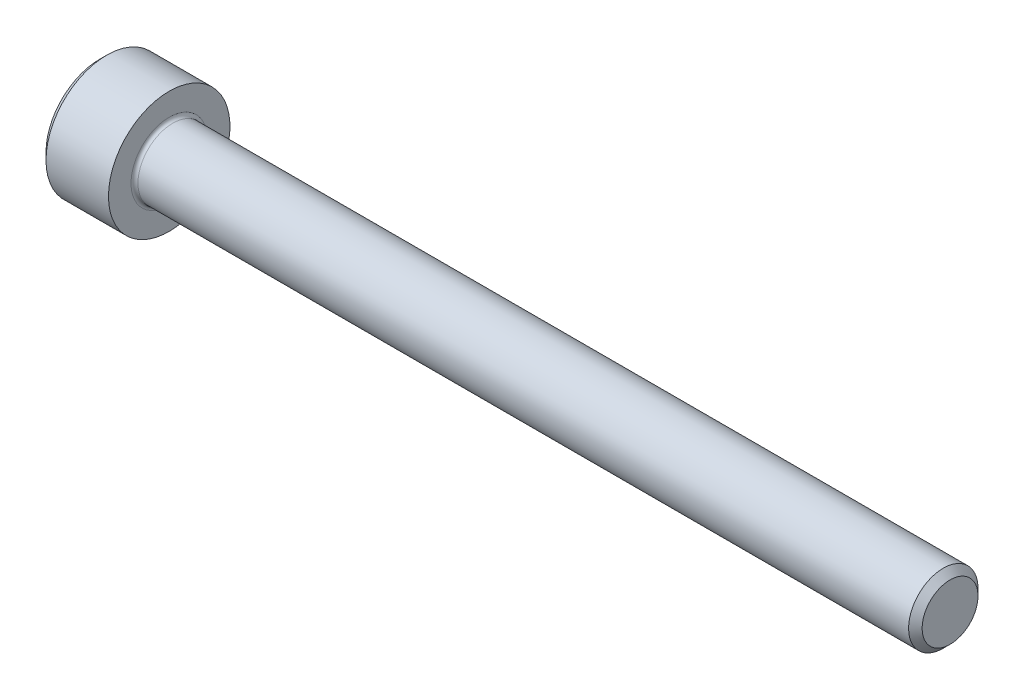
ISO-10303-21;
HEADER;
FILE_DESCRIPTION(('STEP AP214'),'2;1');
FILE_NAME('part.step','',(''),(''),'','','');
FILE_SCHEMA(('AUTOMOTIVE_DESIGN { 1 0 10303 214 1 1 1 1 }'));
ENDSEC;
DATA;
#1=APPLICATION_CONTEXT('core data for automotive mechanical design processes');
#2=APPLICATION_PROTOCOL_DEFINITION('international standard','automotive_design',2000,#1);
#3=PRODUCT_CONTEXT('',#1,'mechanical');
#4=PRODUCT('Part','Part','',(#3));
#5=PRODUCT_RELATED_PRODUCT_CATEGORY('part','',(#4));
#6=PRODUCT_DEFINITION_FORMATION('','',#4);
#7=PRODUCT_DEFINITION_CONTEXT('part definition',#1,'design');
#8=PRODUCT_DEFINITION('design','',#6,#7);
#9=PRODUCT_DEFINITION_SHAPE('','',#8);
#10=(LENGTH_UNIT() NAMED_UNIT(*) SI_UNIT(.MILLI.,.METRE.));
#11=(NAMED_UNIT(*) PLANE_ANGLE_UNIT() SI_UNIT($,.RADIAN.));
#12=(NAMED_UNIT(*) SI_UNIT($,.STERADIAN.) SOLID_ANGLE_UNIT());
#13=UNCERTAINTY_MEASURE_WITH_UNIT(LENGTH_MEASURE(1.E-05),#10,'distance_accuracy_value','');
#14=(GEOMETRIC_REPRESENTATION_CONTEXT(3) GLOBAL_UNCERTAINTY_ASSIGNED_CONTEXT((#13)) GLOBAL_UNIT_ASSIGNED_CONTEXT((#10,
#11,#12)) REPRESENTATION_CONTEXT('',''));
#15=CARTESIAN_POINT('',(0.,0.,0.));
#16=DIRECTION('',(0.,0.,1.));
#17=DIRECTION('',(1.,0.,0.));
#18=AXIS2_PLACEMENT_3D('',#15,#16,#17);
#19=CARTESIAN_POINT('',(0.,0.,0.));
#20=DIRECTION('',(-1.,0.,0.));
#21=DIRECTION('',(0.,0.,1.));
#22=AXIS2_PLACEMENT_3D('',#19,#20,#21);
#23=PLANE('',#22);
#24=DIRECTION('',(0.,-0.499999999999999,0.866025403784439));
#25=VECTOR('',#24,1.);
#26=CARTESIAN_POINT('',(0.,1.77304267668134,0.));
#27=LINE('',#26,#25);
#28=CARTESIAN_POINT('',(0.,1.77304267668134,0.));
#29=VERTEX_POINT('',#28);
#30=CARTESIAN_POINT('',(0.,0.886521338340669,1.5355));
#31=VERTEX_POINT('',#30);
#32=EDGE_CURVE('E388',#29,#31,#27,.T.);
#33=ORIENTED_EDGE('',*,*,#32,.T.);
#34=DIRECTION('',(0.,1.,0.));
#35=VECTOR('',#34,1.);
#36=CARTESIAN_POINT('',(0.,-0.886521338340671,1.5355));
#37=LINE('',#36,#35);
#38=CARTESIAN_POINT('',(0.,-0.886521338340671,1.5355));
#39=VERTEX_POINT('',#38);
#40=EDGE_CURVE('E132',#39,#31,#37,.T.);
#41=ORIENTED_EDGE('',*,*,#40,.F.);
#42=DIRECTION('',(0.,-0.500000000000001,-0.866025403784438));
#43=VECTOR('',#42,1.);
#44=CARTESIAN_POINT('',(0.,-0.886521338340671,1.5355));
#45=LINE('',#44,#43);
#46=CARTESIAN_POINT('',(0.,-1.77304267668134,0.));
#47=VERTEX_POINT('',#46);
#48=EDGE_CURVE('E391',#39,#47,#45,.T.);
#49=ORIENTED_EDGE('',*,*,#48,.T.);
#50=DIRECTION('',(0.,0.499999999999999,-0.866025403784439));
#51=VECTOR('',#50,1.);
#52=CARTESIAN_POINT('',(0.,-1.77304267668134,0.));
#53=LINE('',#52,#51);
#54=CARTESIAN_POINT('',(0.,-0.886521338340676,-1.5355));
#55=VERTEX_POINT('',#54);
#56=EDGE_CURVE('E394',#47,#55,#53,.T.);
#57=ORIENTED_EDGE('',*,*,#56,.T.);
#58=DIRECTION('',(0.,-1.,0.));
#59=VECTOR('',#58,1.);
#60=CARTESIAN_POINT('',(0.,0.886521338340665,-1.5355));
#61=LINE('',#60,#59);
#62=CARTESIAN_POINT('',(0.,0.886521338340665,-1.5355));
#63=VERTEX_POINT('',#62);
#64=EDGE_CURVE('E397',#63,#55,#61,.T.);
#65=ORIENTED_EDGE('',*,*,#64,.F.);
#66=DIRECTION('',(0.,-0.500000000000001,-0.866025403784438));
#67=VECTOR('',#66,1.);
#68=CARTESIAN_POINT('',(0.,1.77304267668134,0.));
#69=LINE('',#68,#67);
#70=EDGE_CURVE('E127',#29,#63,#69,.T.);
#71=ORIENTED_EDGE('',*,*,#70,.F.);
#72=EDGE_LOOP('',(#33,#41,#49,#57,#65,#71));
#73=FACE_BOUND('',#72,.T.);
#74=CARTESIAN_POINT('',(0.,0.,0.));
#75=DIRECTION('',(-1.,0.,0.));
#76=DIRECTION('',(0.,0.,1.));
#77=AXIS2_PLACEMENT_3D('',#74,#75,#76);
#78=CIRCLE('',#77,3.1);
#79=CARTESIAN_POINT('',(0.,0.,3.1));
#80=VERTEX_POINT('',#79);
#81=EDGE_CURVE('E143',#80,#80,#78,.T.);
#82=ORIENTED_EDGE('',*,*,#81,.T.);
#83=EDGE_LOOP('',(#82));
#84=FACE_BOUND('',#83,.T.);
#85=ADVANCED_FACE('F36',(#73,#84),#23,.T.);
#86=CARTESIAN_POINT('',(49.,1.61,0.));
#87=DIRECTION('',(1.,0.,0.));
#88=DIRECTION('',(0.,0.,-1.));
#89=AXIS2_PLACEMENT_3D('',#86,#87,#88);
#90=PLANE('',#89);
#91=CARTESIAN_POINT('',(49.,0.,0.));
#92=DIRECTION('',(-1.,0.,0.));
#93=DIRECTION('',(0.,0.,1.));
#94=AXIS2_PLACEMENT_3D('',#91,#92,#93);
#95=CIRCLE('',#94,1.61);
#96=CARTESIAN_POINT('',(49.,0.,1.61));
#97=VERTEX_POINT('',#96);
#98=EDGE_CURVE('E156',#97,#97,#95,.T.);
#99=ORIENTED_EDGE('',*,*,#98,.F.);
#100=EDGE_LOOP('',(#99));
#101=FACE_BOUND('',#100,.T.);
#102=ADVANCED_FACE('F177',(#101),#90,.T.);
#103=CARTESIAN_POINT('',(49.,0.,0.));
#104=DIRECTION('',(-1.,0.,0.));
#105=DIRECTION('',(0.,0.,1.));
#106=AXIS2_PLACEMENT_3D('',#103,#104,#105);
#107=CONICAL_SURFACE('',#106,1.61,0.785398163397374);
#108=CARTESIAN_POINT('',(48.61,0.,0.));
#109=DIRECTION('',(-1.,0.,0.));
#110=DIRECTION('',(0.,0.,1.));
#111=AXIS2_PLACEMENT_3D('',#108,#109,#110);
#112=CIRCLE('',#111,1.99999999999997);
#113=CARTESIAN_POINT('',(48.61,0.,1.99999999999997));
#114=VERTEX_POINT('',#113);
#115=EDGE_CURVE('E153',#114,#114,#112,.T.);
#116=ORIENTED_EDGE('',*,*,#115,.F.);
#117=EDGE_LOOP('',(#116));
#118=FACE_BOUND('',#117,.T.);
#119=ORIENTED_EDGE('',*,*,#98,.T.);
#120=EDGE_LOOP('',(#119));
#121=FACE_BOUND('',#120,.T.);
#122=ADVANCED_FACE('F183',(#118,#121),#107,.T.);
#123=CARTESIAN_POINT('',(-31.75,0.,0.));
#124=DIRECTION('',(-1.,0.,0.));
#125=DIRECTION('',(0.,0.,1.));
#126=AXIS2_PLACEMENT_3D('',#123,#124,#125);
#127=CYLINDRICAL_SURFACE('',#126,1.99999999999999);
#128=CARTESIAN_POINT('',(4.2,0.,0.));
#129=DIRECTION('',(1.,0.,0.));
#130=DIRECTION('',(0.,0.,-1.));
#131=AXIS2_PLACEMENT_3D('',#128,#129,#130);
#132=CIRCLE('',#131,1.99999999999999);
#133=CARTESIAN_POINT('',(4.2,0.,-1.99999999999999));
#134=VERTEX_POINT('',#133);
#135=EDGE_CURVE('E11',#134,#134,#132,.T.);
#136=ORIENTED_EDGE('',*,*,#135,.T.);
#137=EDGE_LOOP('',(#136));
#138=FACE_BOUND('',#137,.T.);
#139=ORIENTED_EDGE('',*,*,#115,.T.);
#140=EDGE_LOOP('',(#139));
#141=FACE_BOUND('',#140,.T.);
#142=ADVANCED_FACE('F194',(#138,#141),#127,.T.);
#143=CARTESIAN_POINT('',(4.,3.5,0.));
#144=DIRECTION('',(1.,0.,0.));
#145=DIRECTION('',(0.,0.,-1.));
#146=AXIS2_PLACEMENT_3D('',#143,#144,#145);
#147=PLANE('',#146);
#148=CARTESIAN_POINT('',(4.,0.,0.));
#149=DIRECTION('',(1.,0.,0.));
#150=DIRECTION('',(0.,0.,-1.));
#151=AXIS2_PLACEMENT_3D('',#148,#149,#150);
#152=CIRCLE('',#151,2.19999999999999);
#153=CARTESIAN_POINT('',(4.,0.,-2.19999999999999));
#154=VERTEX_POINT('',#153);
#155=EDGE_CURVE('E44',#154,#154,#152,.F.);
#156=ORIENTED_EDGE('',*,*,#155,.T.);
#157=EDGE_LOOP('',(#156));
#158=FACE_BOUND('',#157,.T.);
#159=CARTESIAN_POINT('',(4.,0.,0.));
#160=DIRECTION('',(-1.,0.,0.));
#161=DIRECTION('',(0.,0.,1.));
#162=AXIS2_PLACEMENT_3D('',#159,#160,#161);
#163=CIRCLE('',#162,3.5);
#164=CARTESIAN_POINT('',(4.,0.,3.5));
#165=VERTEX_POINT('',#164);
#166=EDGE_CURVE('E150',#165,#165,#163,.T.);
#167=ORIENTED_EDGE('',*,*,#166,.F.);
#168=EDGE_LOOP('',(#167));
#169=FACE_BOUND('',#168,.T.);
#170=ADVANCED_FACE('F161',(#158,#169),#147,.T.);
#171=CARTESIAN_POINT('',(-31.75,0.,0.));
#172=DIRECTION('',(-1.,0.,0.));
#173=DIRECTION('',(0.,0.,1.));
#174=AXIS2_PLACEMENT_3D('',#171,#172,#173);
#175=CYLINDRICAL_SURFACE('',#174,3.5);
#176=ORIENTED_EDGE('',*,*,#166,.T.);
#177=EDGE_LOOP('',(#176));
#178=FACE_BOUND('',#177,.T.);
#179=CARTESIAN_POINT('',(0.399999999999998,0.,0.));
#180=DIRECTION('',(-1.,0.,0.));
#181=DIRECTION('',(0.,0.,1.));
#182=AXIS2_PLACEMENT_3D('',#179,#180,#181);
#183=CIRCLE('',#182,3.5);
#184=CARTESIAN_POINT('',(0.399999999999998,0.,3.5));
#185=VERTEX_POINT('',#184);
#186=EDGE_CURVE('E147',#185,#185,#183,.T.);
#187=ORIENTED_EDGE('',*,*,#186,.F.);
#188=EDGE_LOOP('',(#187));
#189=FACE_BOUND('',#188,.T.);
#190=ADVANCED_FACE('F172',(#178,#189),#175,.T.);
#191=CARTESIAN_POINT('',(0.,0.,0.));
#192=DIRECTION('',(1.,0.,0.));
#193=DIRECTION('',(0.,0.,-1.));
#194=AXIS2_PLACEMENT_3D('',#191,#192,#193);
#195=CONICAL_SURFACE('',#194,3.1,0.785398163397447);
#196=ORIENTED_EDGE('',*,*,#186,.T.);
#197=EDGE_LOOP('',(#196));
#198=FACE_BOUND('',#197,.T.);
#199=ORIENTED_EDGE('',*,*,#81,.F.);
#200=EDGE_LOOP('',(#199));
#201=FACE_BOUND('',#200,.T.);
#202=ADVANCED_FACE('F165',(#198,#201),#195,.T.);
#203=CARTESIAN_POINT('',(4.2,0.,0.));
#204=DIRECTION('',(1.,0.,0.));
#205=DIRECTION('',(0.,0.,-1.));
#206=AXIS2_PLACEMENT_3D('',#203,#204,#205);
#207=TOROIDAL_SURFACE('',#206,2.19999999999999,0.2);
#208=ORIENTED_EDGE('',*,*,#135,.F.);
#209=EDGE_LOOP('',(#208));
#210=FACE_BOUND('',#209,.T.);
#211=ORIENTED_EDGE('',*,*,#155,.F.);
#212=EDGE_LOOP('',(#211));
#213=FACE_BOUND('',#212,.T.);
#214=ADVANCED_FACE('F38',(#210,#213),#207,.F.);
#215=CARTESIAN_POINT('',(2.,1.77304267668134,0.));
#216=DIRECTION('',(0.,-0.866025403784439,-0.499999999999999));
#217=DIRECTION('',(0.,0.499999999999999,-0.866025403784439));
#218=AXIS2_PLACEMENT_3D('',#215,#216,#217);
#219=PLANE('',#218);
#220=ORIENTED_EDGE('',*,*,#32,.F.);
#221=DIRECTION('',(-1.,0.,0.));
#222=VECTOR('',#221,1.);
#223=CARTESIAN_POINT('',(2.,1.77304267668134,0.));
#224=LINE('',#223,#222);
#225=CARTESIAN_POINT('',(2.,1.77304267668134,0.));
#226=VERTEX_POINT('',#225);
#227=EDGE_CURVE('E378',#226,#29,#224,.T.);
#228=ORIENTED_EDGE('',*,*,#227,.F.);
#229=DIRECTION('',(0.,-0.499999999999999,0.866025403784439));
#230=VECTOR('',#229,1.);
#231=CARTESIAN_POINT('',(2.,1.77304267668134,0.));
#232=LINE('',#231,#230);
#233=CARTESIAN_POINT('',(2.,1.329782007511,0.767749999999997));
#234=VERTEX_POINT('',#233);
#235=EDGE_CURVE('E119',#226,#234,#232,.T.);
#236=ORIENTED_EDGE('',*,*,#235,.T.);
#237=CARTESIAN_POINT('',(2.,0.886521338340669,1.5355));
#238=VERTEX_POINT('',#237);
#239=EDGE_CURVE('E110',#234,#238,#232,.T.);
#240=ORIENTED_EDGE('',*,*,#239,.T.);
#241=DIRECTION('',(-1.,0.,0.));
#242=VECTOR('',#241,1.);
#243=CARTESIAN_POINT('',(2.,0.886521338340669,1.5355));
#244=LINE('',#243,#242);
#245=EDGE_CURVE('E124',#238,#31,#244,.T.);
#246=ORIENTED_EDGE('',*,*,#245,.T.);
#247=EDGE_LOOP('',(#220,#228,#236,#240,#246));
#248=FACE_BOUND('',#247,.T.);
#249=ADVANCED_FACE('F123',(#248),#219,.T.);
#250=CARTESIAN_POINT('',(2.,-0.886521338340671,1.5355));
#251=DIRECTION('',(0.,0.,1.));
#252=DIRECTION('',(0.,-1.,0.));
#253=AXIS2_PLACEMENT_3D('',#250,#251,#252);
#254=PLANE('',#253);
#255=ORIENTED_EDGE('',*,*,#40,.T.);
#256=ORIENTED_EDGE('',*,*,#245,.F.);
#257=DIRECTION('',(0.,1.,0.));
#258=VECTOR('',#257,1.);
#259=CARTESIAN_POINT('',(2.,-0.886521338340671,1.5355));
#260=LINE('',#259,#258);
#261=CARTESIAN_POINT('',(2.,0.,1.5355));
#262=VERTEX_POINT('',#261);
#263=EDGE_CURVE('E107',#262,#238,#260,.T.);
#264=ORIENTED_EDGE('',*,*,#263,.F.);
#265=CARTESIAN_POINT('',(2.,-0.886521338340671,1.5355));
#266=VERTEX_POINT('',#265);
#267=EDGE_CURVE('E118',#266,#262,#260,.T.);
#268=ORIENTED_EDGE('',*,*,#267,.F.);
#269=DIRECTION('',(-1.,0.,0.));
#270=VECTOR('',#269,1.);
#271=CARTESIAN_POINT('',(2.,-0.886521338340671,1.5355));
#272=LINE('',#271,#270);
#273=EDGE_CURVE('E134',#266,#39,#272,.T.);
#274=ORIENTED_EDGE('',*,*,#273,.T.);
#275=EDGE_LOOP('',(#255,#256,#264,#268,#274));
#276=FACE_BOUND('',#275,.T.);
#277=ADVANCED_FACE('F129',(#276),#254,.F.);
#278=CARTESIAN_POINT('',(2.,-0.886521338340671,1.5355));
#279=DIRECTION('',(0.,0.866025403784438,-0.500000000000001));
#280=DIRECTION('',(0.,0.500000000000001,0.866025403784438));
#281=AXIS2_PLACEMENT_3D('',#278,#279,#280);
#282=PLANE('',#281);
#283=ORIENTED_EDGE('',*,*,#48,.F.);
#284=ORIENTED_EDGE('',*,*,#273,.F.);
#285=DIRECTION('',(0.,-0.500000000000001,-0.866025403784438));
#286=VECTOR('',#285,1.);
#287=CARTESIAN_POINT('',(2.,-0.886521338340671,1.5355));
#288=LINE('',#287,#286);
#289=CARTESIAN_POINT('',(2.,-1.32978200751101,0.767750000000002));
#290=VERTEX_POINT('',#289);
#291=EDGE_CURVE('E417',#266,#290,#288,.T.);
#292=ORIENTED_EDGE('',*,*,#291,.T.);
#293=CARTESIAN_POINT('',(2.,-1.77304267668134,0.));
#294=VERTEX_POINT('',#293);
#295=EDGE_CURVE('E406',#290,#294,#288,.T.);
#296=ORIENTED_EDGE('',*,*,#295,.T.);
#297=DIRECTION('',(-1.,0.,0.));
#298=VECTOR('',#297,1.);
#299=CARTESIAN_POINT('',(2.,-1.77304267668134,0.));
#300=LINE('',#299,#298);
#301=EDGE_CURVE('E139',#294,#47,#300,.T.);
#302=ORIENTED_EDGE('',*,*,#301,.T.);
#303=EDGE_LOOP('',(#283,#284,#292,#296,#302));
#304=FACE_BOUND('',#303,.T.);
#305=ADVANCED_FACE('F269',(#304),#282,.T.);
#306=CARTESIAN_POINT('',(2.,-1.77304267668134,0.));
#307=DIRECTION('',(0.,0.866025403784439,0.499999999999999));
#308=DIRECTION('',(0.,-0.499999999999999,0.866025403784439));
#309=AXIS2_PLACEMENT_3D('',#306,#307,#308);
#310=PLANE('',#309);
#311=ORIENTED_EDGE('',*,*,#56,.F.);
#312=ORIENTED_EDGE('',*,*,#301,.F.);
#313=DIRECTION('',(0.,0.499999999999999,-0.866025403784439));
#314=VECTOR('',#313,1.);
#315=CARTESIAN_POINT('',(2.,-1.77304267668134,0.));
#316=LINE('',#315,#314);
#317=CARTESIAN_POINT('',(2.,-1.32978200751101,-0.76775));
#318=VERTEX_POINT('',#317);
#319=EDGE_CURVE('E384',#294,#318,#316,.T.);
#320=ORIENTED_EDGE('',*,*,#319,.T.);
#321=CARTESIAN_POINT('',(2.,-0.886521338340676,-1.5355));
#322=VERTEX_POINT('',#321);
#323=EDGE_CURVE('E416',#318,#322,#316,.T.);
#324=ORIENTED_EDGE('',*,*,#323,.T.);
#325=DIRECTION('',(-1.,0.,0.));
#326=VECTOR('',#325,1.);
#327=CARTESIAN_POINT('',(2.,-0.886521338340676,-1.5355));
#328=LINE('',#327,#326);
#329=EDGE_CURVE('E377',#322,#55,#328,.T.);
#330=ORIENTED_EDGE('',*,*,#329,.T.);
#331=EDGE_LOOP('',(#311,#312,#320,#324,#330));
#332=FACE_BOUND('',#331,.T.);
#333=ADVANCED_FACE('F277',(#332),#310,.T.);
#334=CARTESIAN_POINT('',(2.,0.886521338340665,-1.5355));
#335=DIRECTION('',(0.,0.,-1.));
#336=DIRECTION('',(0.,1.,0.));
#337=AXIS2_PLACEMENT_3D('',#334,#335,#336);
#338=PLANE('',#337);
#339=ORIENTED_EDGE('',*,*,#64,.T.);
#340=ORIENTED_EDGE('',*,*,#329,.F.);
#341=DIRECTION('',(0.,-1.,0.));
#342=VECTOR('',#341,1.);
#343=CARTESIAN_POINT('',(2.,0.886521338340665,-1.5355));
#344=LINE('',#343,#342);
#345=CARTESIAN_POINT('',(2.,0.,-1.5355));
#346=VERTEX_POINT('',#345);
#347=EDGE_CURVE('E381',#346,#322,#344,.T.);
#348=ORIENTED_EDGE('',*,*,#347,.F.);
#349=CARTESIAN_POINT('',(2.,0.886521338340665,-1.5355));
#350=VERTEX_POINT('',#349);
#351=EDGE_CURVE('E51',#350,#346,#344,.T.);
#352=ORIENTED_EDGE('',*,*,#351,.F.);
#353=DIRECTION('',(-1.,0.,0.));
#354=VECTOR('',#353,1.);
#355=CARTESIAN_POINT('',(2.,0.886521338340665,-1.5355));
#356=LINE('',#355,#354);
#357=EDGE_CURVE('E374',#350,#63,#356,.T.);
#358=ORIENTED_EDGE('',*,*,#357,.T.);
#359=EDGE_LOOP('',(#339,#340,#348,#352,#358));
#360=FACE_BOUND('',#359,.T.);
#361=ADVANCED_FACE('F286',(#360),#338,.F.);
#362=CARTESIAN_POINT('',(2.,1.77304267668134,0.));
#363=DIRECTION('',(0.,0.866025403784438,-0.500000000000001));
#364=DIRECTION('',(0.,0.500000000000001,0.866025403784438));
#365=AXIS2_PLACEMENT_3D('',#362,#363,#364);
#366=PLANE('',#365);
#367=ORIENTED_EDGE('',*,*,#70,.T.);
#368=ORIENTED_EDGE('',*,*,#357,.F.);
#369=DIRECTION('',(0.,-0.500000000000001,-0.866025403784438));
#370=VECTOR('',#369,1.);
#371=CARTESIAN_POINT('',(2.,1.77304267668134,0.));
#372=LINE('',#371,#370);
#373=CARTESIAN_POINT('',(2.,1.329782007511,-0.767750000000001));
#374=VERTEX_POINT('',#373);
#375=EDGE_CURVE('E364',#374,#350,#372,.T.);
#376=ORIENTED_EDGE('',*,*,#375,.F.);
#377=EDGE_CURVE('E370',#226,#374,#372,.T.);
#378=ORIENTED_EDGE('',*,*,#377,.F.);
#379=ORIENTED_EDGE('',*,*,#227,.T.);
#380=EDGE_LOOP('',(#367,#368,#376,#378,#379));
#381=FACE_BOUND('',#380,.T.);
#382=ADVANCED_FACE('F295',(#381),#366,.F.);
#383=CARTESIAN_POINT('',(2.,1.77304267668134,0.));
#384=DIRECTION('',(1.,0.,0.));
#385=DIRECTION('',(0.,0.,-1.));
#386=AXIS2_PLACEMENT_3D('',#383,#384,#385);
#387=PLANE('',#386);
#388=ORIENTED_EDGE('',*,*,#347,.T.);
#389=ORIENTED_EDGE('',*,*,#323,.F.);
#390=CARTESIAN_POINT('',(2.,0.,0.));
#391=DIRECTION('',(-1.,0.,0.));
#392=DIRECTION('',(0.,0.,1.));
#393=AXIS2_PLACEMENT_3D('',#390,#391,#392);
#394=CIRCLE('',#393,1.5355);
#395=EDGE_CURVE('E412',#346,#318,#394,.T.);
#396=ORIENTED_EDGE('',*,*,#395,.F.);
#397=EDGE_LOOP('',(#388,#389,#396));
#398=FACE_BOUND('',#397,.T.);
#399=ADVANCED_FACE('F304',(#398),#387,.F.);
#400=ORIENTED_EDGE('',*,*,#319,.F.);
#401=ORIENTED_EDGE('',*,*,#295,.F.);
#402=EDGE_CURVE('E137',#318,#290,#394,.T.);
#403=ORIENTED_EDGE('',*,*,#402,.F.);
#404=EDGE_LOOP('',(#400,#401,#403));
#405=FACE_BOUND('',#404,.T.);
#406=ADVANCED_FACE('F313',(#405),#387,.F.);
#407=ORIENTED_EDGE('',*,*,#291,.F.);
#408=ORIENTED_EDGE('',*,*,#267,.T.);
#409=EDGE_CURVE('E133',#290,#262,#394,.T.);
#410=ORIENTED_EDGE('',*,*,#409,.F.);
#411=EDGE_LOOP('',(#407,#408,#410));
#412=FACE_BOUND('',#411,.T.);
#413=ADVANCED_FACE('F322',(#412),#387,.F.);
#414=ORIENTED_EDGE('',*,*,#263,.T.);
#415=ORIENTED_EDGE('',*,*,#239,.F.);
#416=EDGE_CURVE('E113',#262,#234,#394,.T.);
#417=ORIENTED_EDGE('',*,*,#416,.F.);
#418=EDGE_LOOP('',(#414,#415,#417));
#419=FACE_BOUND('',#418,.T.);
#420=ADVANCED_FACE('F109',(#419),#387,.F.);
#421=ORIENTED_EDGE('',*,*,#235,.F.);
#422=ORIENTED_EDGE('',*,*,#377,.T.);
#423=EDGE_CURVE('E144',#234,#374,#394,.T.);
#424=ORIENTED_EDGE('',*,*,#423,.F.);
#425=EDGE_LOOP('',(#421,#422,#424));
#426=FACE_BOUND('',#425,.T.);
#427=ADVANCED_FACE('F337',(#426),#387,.F.);
#428=ORIENTED_EDGE('',*,*,#375,.T.);
#429=ORIENTED_EDGE('',*,*,#351,.T.);
#430=EDGE_CURVE('E367',#374,#346,#394,.T.);
#431=ORIENTED_EDGE('',*,*,#430,.F.);
#432=EDGE_LOOP('',(#428,#429,#431));
#433=FACE_BOUND('',#432,.T.);
#434=ADVANCED_FACE('F252',(#433),#387,.F.);
#435=CARTESIAN_POINT('',(2.,0.,0.));
#436=DIRECTION('',(-1.,0.,0.));
#437=DIRECTION('',(0.,0.,1.));
#438=AXIS2_PLACEMENT_3D('',#435,#436,#437);
#439=CONICAL_SURFACE('',#438,1.5355,1.04719755119659);
#440=CARTESIAN_POINT('',(2.88652133834068,0.,0.));
#441=VERTEX_POINT('',#440);
#442=VERTEX_LOOP('',#441);
#443=FACE_BOUND('',#442,.T.);
#444=ORIENTED_EDGE('',*,*,#416,.T.);
#445=ORIENTED_EDGE('',*,*,#423,.T.);
#446=ORIENTED_EDGE('',*,*,#430,.T.);
#447=ORIENTED_EDGE('',*,*,#395,.T.);
#448=ORIENTED_EDGE('',*,*,#402,.T.);
#449=ORIENTED_EDGE('',*,*,#409,.T.);
#450=EDGE_LOOP('',(#444,#445,#446,#447,#448,#449));
#451=FACE_BOUND('',#450,.T.);
#452=ADVANCED_FACE('F187',(#443,#451),#439,.F.);
#453=CLOSED_SHELL('',(#85,#102,#122,#142,#170,#190,#202,#214,#249,#277,#305,#333,#361,#382,#399,
#406,#413,#420,#427,#434,#452));
#454=MANIFOLD_SOLID_BREP('B2',#453);
#455=ADVANCED_BREP_SHAPE_REPRESENTATION('',(#18,#454),#14);
#456=SHAPE_DEFINITION_REPRESENTATION(#9,#455);
ENDSEC;
END-ISO-10303-21;
